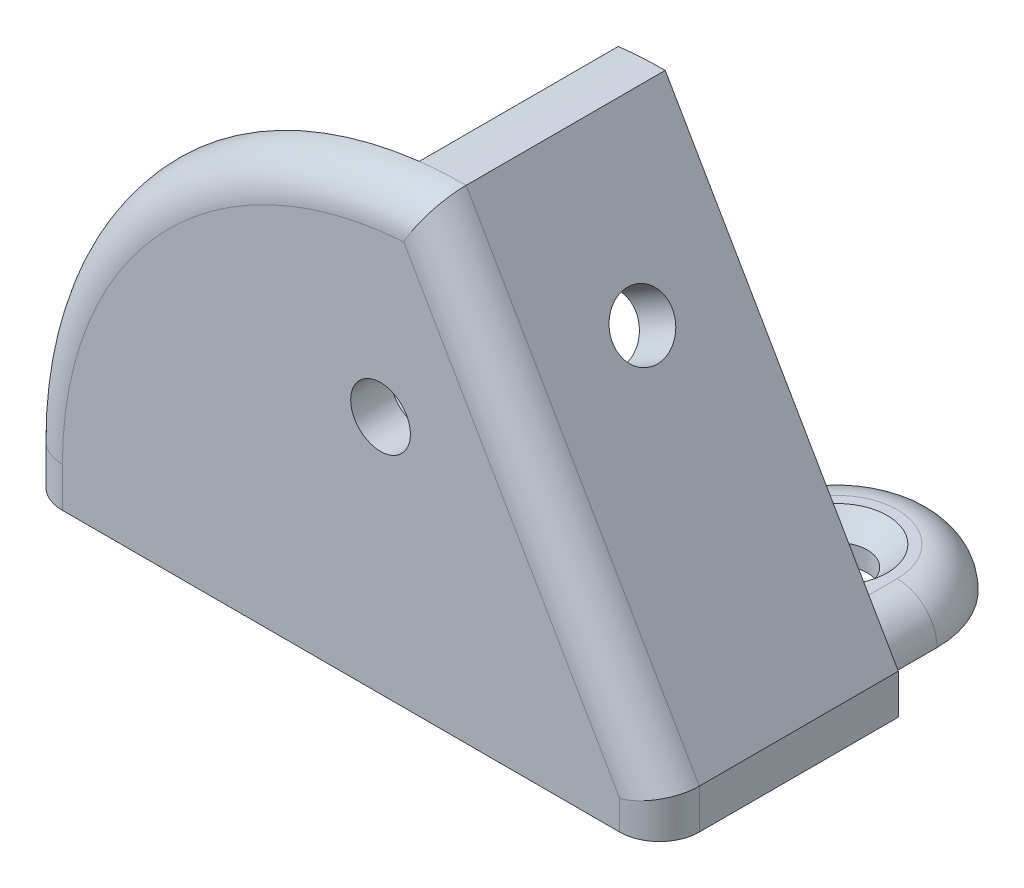
ISO-10303-21;
HEADER;
FILE_DESCRIPTION(('STEP AP214'),'2;1');
FILE_NAME('part.step','',(''),(''),'','','');
FILE_SCHEMA(('AUTOMOTIVE_DESIGN { 1 0 10303 214 1 1 1 1 }'));
ENDSEC;
DATA;
#1=APPLICATION_CONTEXT('core data for automotive mechanical design processes');
#2=APPLICATION_PROTOCOL_DEFINITION('international standard','automotive_design',2000,#1);
#3=PRODUCT_CONTEXT('',#1,'mechanical');
#4=PRODUCT('Part','Part','',(#3));
#5=PRODUCT_RELATED_PRODUCT_CATEGORY('part','',(#4));
#6=PRODUCT_DEFINITION_FORMATION('','',#4);
#7=PRODUCT_DEFINITION_CONTEXT('part definition',#1,'design');
#8=PRODUCT_DEFINITION('design','',#6,#7);
#9=PRODUCT_DEFINITION_SHAPE('','',#8);
#10=(LENGTH_UNIT() NAMED_UNIT(*) SI_UNIT(.MILLI.,.METRE.));
#11=(NAMED_UNIT(*) PLANE_ANGLE_UNIT() SI_UNIT($,.RADIAN.));
#12=(NAMED_UNIT(*) SI_UNIT($,.STERADIAN.) SOLID_ANGLE_UNIT());
#13=UNCERTAINTY_MEASURE_WITH_UNIT(LENGTH_MEASURE(1.E-05),#10,'distance_accuracy_value','');
#14=(GEOMETRIC_REPRESENTATION_CONTEXT(3) GLOBAL_UNCERTAINTY_ASSIGNED_CONTEXT((#13)) GLOBAL_UNIT_ASSIGNED_CONTEXT((#10,
#11,#12)) REPRESENTATION_CONTEXT('',''));
#15=CARTESIAN_POINT('',(0.,0.,0.));
#16=DIRECTION('',(0.,0.,1.));
#17=DIRECTION('',(1.,0.,0.));
#18=AXIS2_PLACEMENT_3D('',#15,#16,#17);
#19=CARTESIAN_POINT('',(0.,0.,-4.));
#20=DIRECTION('',(0.,-1.,0.));
#21=DIRECTION('',(0.,0.,-1.));
#22=AXIS2_PLACEMENT_3D('',#19,#20,#21);
#23=PLANE('',#22);
#24=CARTESIAN_POINT('',(-14.1110533640811,0.,-32.));
#25=DIRECTION('',(0.,1.,0.));
#26=DIRECTION('',(0.,0.,1.));
#27=AXIS2_PLACEMENT_3D('',#24,#25,#26);
#28=CIRCLE('',#27,3.);
#29=CARTESIAN_POINT('',(-14.1110533640811,0.,-29.));
#30=VERTEX_POINT('',#29);
#31=EDGE_CURVE('E396',#30,#30,#28,.T.);
#32=ORIENTED_EDGE('',*,*,#31,.T.);
#33=EDGE_LOOP('',(#32));
#34=FACE_BOUND('',#33,.T.);
#35=CARTESIAN_POINT('',(-52.,0.,-14.));
#36=DIRECTION('',(0.,1.,0.));
#37=DIRECTION('',(-1.,0.,0.));
#38=AXIS2_PLACEMENT_3D('',#35,#36,#37);
#39=CIRCLE('',#38,3.);
#40=CARTESIAN_POINT('',(-55.,0.,-14.));
#41=VERTEX_POINT('',#40);
#42=EDGE_CURVE('E402',#41,#41,#39,.T.);
#43=ORIENTED_EDGE('',*,*,#42,.T.);
#44=EDGE_LOOP('',(#43));
#45=FACE_BOUND('',#44,.T.);
#46=CARTESIAN_POINT('',(-14.1110533640811,0.,-14.));
#47=DIRECTION('',(0.,-1.,0.));
#48=DIRECTION('',(-1.,0.,0.));
#49=AXIS2_PLACEMENT_3D('',#46,#47,#48);
#50=ELLIPSE('',#49,5.77350269189625,5.);
#51=CARTESIAN_POINT('',(-19.8845560559774,0.,-14.));
#52=VERTEX_POINT('',#51);
#53=EDGE_CURVE('E419',#52,#52,#50,.T.);
#54=ORIENTED_EDGE('',*,*,#53,.F.);
#55=EDGE_LOOP('',(#54));
#56=FACE_BOUND('',#55,.T.);
#57=DIRECTION('',(1.,0.,0.));
#58=VECTOR('',#57,1.);
#59=CARTESIAN_POINT('',(0.,0.,0.));
#60=LINE('',#59,#58);
#61=CARTESIAN_POINT('',(-60.,0.,0.));
#62=VERTEX_POINT('',#61);
#63=CARTESIAN_POINT('',(-4.,0.,0.));
#64=VERTEX_POINT('',#63);
#65=EDGE_CURVE('E352',#62,#64,#60,.T.);
#66=ORIENTED_EDGE('',*,*,#65,.F.);
#67=CARTESIAN_POINT('',(-60.,0.,-4.));
#68=DIRECTION('',(0.,-1.,0.));
#69=DIRECTION('',(0.,0.,-1.));
#70=AXIS2_PLACEMENT_3D('',#67,#68,#69);
#71=CIRCLE('',#70,4.);
#72=CARTESIAN_POINT('',(-64.,0.,-4.));
#73=VERTEX_POINT('',#72);
#74=EDGE_CURVE('E197',#62,#73,#71,.T.);
#75=ORIENTED_EDGE('',*,*,#74,.T.);
#76=DIRECTION('',(0.,0.,1.));
#77=VECTOR('',#76,1.);
#78=CARTESIAN_POINT('',(-64.,0.,-4.));
#79=LINE('',#78,#77);
#80=CARTESIAN_POINT('',(-64.,0.,-24.));
#81=VERTEX_POINT('',#80);
#82=EDGE_CURVE('E338',#81,#73,#79,.T.);
#83=ORIENTED_EDGE('',*,*,#82,.F.);
#84=DIRECTION('',(-1.,0.,0.));
#85=VECTOR('',#84,1.);
#86=CARTESIAN_POINT('',(0.,0.,-24.));
#87=LINE('',#86,#85);
#88=CARTESIAN_POINT('',(-24.1110533640811,0.,-24.));
#89=VERTEX_POINT('',#88);
#90=EDGE_CURVE('E166',#89,#81,#87,.T.);
#91=ORIENTED_EDGE('',*,*,#90,.F.);
#92=DIRECTION('',(0.,0.,1.));
#93=VECTOR('',#92,1.);
#94=CARTESIAN_POINT('',(-24.1110533640811,0.,-24.));
#95=LINE('',#94,#93);
#96=CARTESIAN_POINT('',(-24.1110533640811,0.,-32.));
#97=VERTEX_POINT('',#96);
#98=EDGE_CURVE('E154',#97,#89,#95,.T.);
#99=ORIENTED_EDGE('',*,*,#98,.F.);
#100=CARTESIAN_POINT('',(-14.1110533640811,0.,-32.));
#101=DIRECTION('',(0.,1.,0.));
#102=DIRECTION('',(0.,0.,-1.));
#103=AXIS2_PLACEMENT_3D('',#100,#101,#102);
#104=CIRCLE('',#103,10.);
#105=CARTESIAN_POINT('',(-4.11105336408113,0.,-32.));
#106=VERTEX_POINT('',#105);
#107=EDGE_CURVE('E149',#106,#97,#104,.T.);
#108=ORIENTED_EDGE('',*,*,#107,.F.);
#109=DIRECTION('',(0.,0.,-1.));
#110=VECTOR('',#109,1.);
#111=CARTESIAN_POINT('',(-4.11105336408113,0.,-24.));
#112=LINE('',#111,#110);
#113=CARTESIAN_POINT('',(-4.11105336408113,0.,-24.));
#114=VERTEX_POINT('',#113);
#115=EDGE_CURVE('E143',#114,#106,#112,.T.);
#116=ORIENTED_EDGE('',*,*,#115,.F.);
#117=CARTESIAN_POINT('',(0.,0.,-24.));
#118=VERTEX_POINT('',#117);
#119=EDGE_CURVE('E147',#118,#114,#87,.T.);
#120=ORIENTED_EDGE('',*,*,#119,.F.);
#121=DIRECTION('',(0.,0.,1.));
#122=VECTOR('',#121,1.);
#123=CARTESIAN_POINT('',(0.,0.,-4.));
#124=LINE('',#123,#122);
#125=CARTESIAN_POINT('',(0.,0.,-4.));
#126=VERTEX_POINT('',#125);
#127=EDGE_CURVE('E356',#118,#126,#124,.T.);
#128=ORIENTED_EDGE('',*,*,#127,.T.);
#129=CARTESIAN_POINT('',(-4.,0.,-4.));
#130=DIRECTION('',(0.,-1.,0.));
#131=DIRECTION('',(0.,0.,-1.));
#132=AXIS2_PLACEMENT_3D('',#129,#130,#131);
#133=CIRCLE('',#132,4.);
#134=EDGE_CURVE('E195',#126,#64,#133,.T.);
#135=ORIENTED_EDGE('',*,*,#134,.T.);
#136=EDGE_LOOP('',(#66,#75,#83,#91,#99,#108,#116,#120,#128,#135));
#137=FACE_BOUND('',#136,.T.);
#138=ADVANCED_FACE('F33',(#34,#45,#56,#137),#23,.T.);
#139=CARTESIAN_POINT('',(-64.,0.,-4.));
#140=DIRECTION('',(-1.,0.,0.));
#141=DIRECTION('',(0.,0.,1.));
#142=AXIS2_PLACEMENT_3D('',#139,#140,#141);
#143=PLANE('',#142);
#144=ORIENTED_EDGE('',*,*,#82,.T.);
#145=DIRECTION('',(0.,-1.,0.));
#146=VECTOR('',#145,1.);
#147=CARTESIAN_POINT('',(-64.,4.,-4.));
#148=LINE('',#147,#146);
#149=CARTESIAN_POINT('',(-64.,4.,-4.));
#150=VERTEX_POINT('',#149);
#151=EDGE_CURVE('E199',#73,#150,#148,.F.);
#152=ORIENTED_EDGE('',*,*,#151,.T.);
#153=DIRECTION('',(0.,0.,1.));
#154=VECTOR('',#153,1.);
#155=CARTESIAN_POINT('',(-64.,4.,-24.));
#156=LINE('',#155,#154);
#157=CARTESIAN_POINT('',(-64.,4.,-24.));
#158=VERTEX_POINT('',#157);
#159=EDGE_CURVE('E369',#158,#150,#156,.T.);
#160=ORIENTED_EDGE('',*,*,#159,.F.);
#161=DIRECTION('',(0.,1.,0.));
#162=VECTOR('',#161,1.);
#163=CARTESIAN_POINT('',(-64.,0.,-24.));
#164=LINE('',#163,#162);
#165=EDGE_CURVE('E420',#81,#158,#164,.T.);
#166=ORIENTED_EDGE('',*,*,#165,.F.);
#167=EDGE_LOOP('',(#144,#152,#160,#166));
#168=FACE_BOUND('',#167,.T.);
#169=ADVANCED_FACE('F229',(#168),#143,.T.);
#170=CARTESIAN_POINT('',(-23.425625842204,4.,-4.));
#171=DIRECTION('',(0.,0.,1.));
#172=DIRECTION('',(1.,0.,0.));
#173=AXIS2_PLACEMENT_3D('',#170,#171,#172);
#174=CYLINDRICAL_SURFACE('',#173,40.574374157796);
#175=DIRECTION('',(0.,0.,1.));
#176=VECTOR('',#175,1.);
#177=CARTESIAN_POINT('',(-28.1403847306629,44.2995147231393,-24.));
#178=LINE('',#177,#176);
#179=CARTESIAN_POINT('',(-28.1403847306629,44.2995147231393,-24.));
#180=VERTEX_POINT('',#179);
#181=CARTESIAN_POINT('',(-28.1403847306629,44.2995147231393,-4.));
#182=VERTEX_POINT('',#181);
#183=EDGE_CURVE('E165',#180,#182,#178,.T.);
#184=ORIENTED_EDGE('',*,*,#183,.T.);
#185=CARTESIAN_POINT('',(-23.425625842204,4.,-4.));
#186=DIRECTION('',(0.,0.,-1.));
#187=DIRECTION('',(-1.,0.,0.));
#188=AXIS2_PLACEMENT_3D('',#185,#186,#187);
#189=CIRCLE('',#188,40.574374157796);
#190=CARTESIAN_POINT('',(-23.425625842204,44.574374157796,-4.));
#191=VERTEX_POINT('',#190);
#192=EDGE_CURVE('E11',#182,#191,#189,.T.);
#193=ORIENTED_EDGE('',*,*,#192,.T.);
#194=DIRECTION('',(0.,0.,1.));
#195=VECTOR('',#194,1.);
#196=CARTESIAN_POINT('',(-23.425625842204,44.574374157796,-4.));
#197=LINE('',#196,#195);
#198=CARTESIAN_POINT('',(-23.425625842204,44.574374157796,-24.));
#199=VERTEX_POINT('',#198);
#200=EDGE_CURVE('E334',#199,#191,#197,.T.);
#201=ORIENTED_EDGE('',*,*,#200,.F.);
#202=CARTESIAN_POINT('',(-23.425625842204,4.,-24.));
#203=DIRECTION('',(0.,0.,-1.));
#204=DIRECTION('',(-1.,0.,0.));
#205=AXIS2_PLACEMENT_3D('',#202,#203,#204);
#206=CIRCLE('',#205,40.574374157796);
#207=EDGE_CURVE('E431',#180,#199,#206,.T.);
#208=ORIENTED_EDGE('',*,*,#207,.F.);
#209=EDGE_LOOP('',(#184,#193,#201,#208));
#210=FACE_BOUND('',#209,.T.);
#211=ADVANCED_FACE('F235',(#210),#174,.T.);
#212=CARTESIAN_POINT('',(0.,4.,-4.));
#213=DIRECTION('',(0.86602540378444,0.499999999999998,0.));
#214=DIRECTION('',(-0.499999999999998,0.86602540378444,0.));
#215=AXIS2_PLACEMENT_3D('',#212,#213,#214);
#216=PLANE('',#215);
#217=CARTESIAN_POINT('',(-15.715774192431,31.2205193815705,-14.));
#218=DIRECTION('',(0.86602540378444,0.499999999999998,0.));
#219=DIRECTION('',(-0.499999999999998,0.86602540378444,0.));
#220=AXIS2_PLACEMENT_3D('',#217,#218,#219);
#221=CIRCLE('',#220,3.);
#222=CARTESIAN_POINT('',(-14.2157741924311,28.6224431702172,-14.));
#223=VERTEX_POINT('',#222);
#224=EDGE_CURVE('E332',#223,#223,#221,.T.);
#225=ORIENTED_EDGE('',*,*,#224,.F.);
#226=EDGE_LOOP('',(#225));
#227=FACE_BOUND('',#226,.T.);
#228=ORIENTED_EDGE('',*,*,#200,.T.);
#229=DIRECTION('',(-0.499999999999998,0.86602540378444,0.));
#230=VECTOR('',#229,1.);
#231=CARTESIAN_POINT('',(0.,4.,-4.));
#232=LINE('',#231,#230);
#233=CARTESIAN_POINT('',(0.,4.,-4.));
#234=VERTEX_POINT('',#233);
#235=EDGE_CURVE('E42',#191,#234,#232,.F.);
#236=ORIENTED_EDGE('',*,*,#235,.T.);
#237=DIRECTION('',(0.,0.,1.));
#238=VECTOR('',#237,1.);
#239=CARTESIAN_POINT('',(0.,4.,-4.));
#240=LINE('',#239,#238);
#241=CARTESIAN_POINT('',(0.,4.,-24.));
#242=VERTEX_POINT('',#241);
#243=EDGE_CURVE('E339',#242,#234,#240,.T.);
#244=ORIENTED_EDGE('',*,*,#243,.F.);
#245=DIRECTION('',(0.499999999999998,-0.86602540378444,0.));
#246=VECTOR('',#245,1.);
#247=CARTESIAN_POINT('',(-23.425625842204,44.574374157796,-24.));
#248=LINE('',#247,#246);
#249=EDGE_CURVE('E335',#199,#242,#248,.T.);
#250=ORIENTED_EDGE('',*,*,#249,.F.);
#251=EDGE_LOOP('',(#228,#236,#244,#250));
#252=FACE_BOUND('',#251,.T.);
#253=ADVANCED_FACE('F323',(#227,#252),#216,.T.);
#254=CARTESIAN_POINT('',(0.,0.,-4.));
#255=DIRECTION('',(1.,0.,0.));
#256=DIRECTION('',(0.,0.,-1.));
#257=AXIS2_PLACEMENT_3D('',#254,#255,#256);
#258=PLANE('',#257);
#259=ORIENTED_EDGE('',*,*,#243,.T.);
#260=DIRECTION('',(0.,1.,0.));
#261=VECTOR('',#260,1.);
#262=CARTESIAN_POINT('',(0.,0.,-4.));
#263=LINE('',#262,#261);
#264=EDGE_CURVE('E201',#234,#126,#263,.F.);
#265=ORIENTED_EDGE('',*,*,#264,.T.);
#266=ORIENTED_EDGE('',*,*,#127,.F.);
#267=DIRECTION('',(0.,-1.,0.));
#268=VECTOR('',#267,1.);
#269=CARTESIAN_POINT('',(0.,4.,-24.));
#270=LINE('',#269,#268);
#271=EDGE_CURVE('E164',#242,#118,#270,.T.);
#272=ORIENTED_EDGE('',*,*,#271,.F.);
#273=EDGE_LOOP('',(#259,#265,#266,#272));
#274=FACE_BOUND('',#273,.T.);
#275=ADVANCED_FACE('F242',(#274),#258,.T.);
#276=CARTESIAN_POINT('',(-23.425625842204,4.,-4.));
#277=DIRECTION('',(0.,0.,-1.));
#278=DIRECTION('',(-1.,0.,0.));
#279=AXIS2_PLACEMENT_3D('',#276,#277,#278);
#280=PLANE('',#279);
#281=CARTESIAN_POINT('',(-28.0311150230608,24.1102540378444,-4.));
#282=DIRECTION('',(0.,0.,-1.));
#283=DIRECTION('',(-1.,0.,0.));
#284=AXIS2_PLACEMENT_3D('',#281,#282,#283);
#285=CIRCLE('',#284,3.);
#286=CARTESIAN_POINT('',(-31.0311150230608,24.1102540378444,-4.));
#287=VERTEX_POINT('',#286);
#288=EDGE_CURVE('E389',#287,#287,#285,.T.);
#289=ORIENTED_EDGE('',*,*,#288,.F.);
#290=EDGE_LOOP('',(#289));
#291=FACE_BOUND('',#290,.T.);
#292=DIRECTION('',(-0.5,0.866025403784439,0.));
#293=VECTOR('',#292,1.);
#294=CARTESIAN_POINT('',(-14.3708609852165,20.45,-4.));
#295=LINE('',#294,#293);
#296=CARTESIAN_POINT('',(-14.3708609852165,20.45,-4.));
#297=VERTEX_POINT('',#296);
#298=EDGE_CURVE('E363',#297,#182,#295,.T.);
#299=ORIENTED_EDGE('',*,*,#298,.F.);
#300=DIRECTION('',(0.866025403784439,0.5,0.));
#301=VECTOR('',#300,1.);
#302=CARTESIAN_POINT('',(-14.3708609852165,20.45,-4.));
#303=LINE('',#302,#301);
#304=CARTESIAN_POINT('',(-31.6913690609052,10.45,-4.));
#305=VERTEX_POINT('',#304);
#306=EDGE_CURVE('E477',#305,#297,#303,.T.);
#307=ORIENTED_EDGE('',*,*,#306,.F.);
#308=CARTESIAN_POINT('',(-35.4152782971783,8.3,-4.));
#309=DIRECTION('',(0.,0.,1.));
#310=DIRECTION('',(-1.,0.,0.));
#311=AXIS2_PLACEMENT_3D('',#308,#309,#310);
#312=CIRCLE('',#311,4.3);
#313=CARTESIAN_POINT('',(-35.4152782971783,4.,-4.));
#314=VERTEX_POINT('',#313);
#315=EDGE_CURVE('E474',#314,#305,#312,.T.);
#316=ORIENTED_EDGE('',*,*,#315,.F.);
#317=DIRECTION('',(1.,0.,0.));
#318=VECTOR('',#317,1.);
#319=CARTESIAN_POINT('',(-64.,4.,-4.));
#320=LINE('',#319,#318);
#321=EDGE_CURVE('E418',#150,#314,#320,.T.);
#322=ORIENTED_EDGE('',*,*,#321,.F.);
#323=CARTESIAN_POINT('',(-23.425625842204,4.,-4.));
#324=DIRECTION('',(0.,0.,1.));
#325=DIRECTION('',(-1.,0.,0.));
#326=AXIS2_PLACEMENT_3D('',#323,#324,#325);
#327=CIRCLE('',#326,40.574374157796);
#328=EDGE_CURVE('E357',#182,#150,#327,.T.);
#329=ORIENTED_EDGE('',*,*,#328,.F.);
#330=EDGE_LOOP('',(#299,#307,#316,#322,#329));
#331=FACE_BOUND('',#330,.T.);
#332=ADVANCED_FACE('F315',(#291,#331),#280,.T.);
#333=CARTESIAN_POINT('',(-23.425625842204,4.,0.));
#334=DIRECTION('',(0.,0.,-1.));
#335=DIRECTION('',(-1.,0.,0.));
#336=AXIS2_PLACEMENT_3D('',#333,#334,#335);
#337=PLANE('',#336);
#338=CARTESIAN_POINT('',(-28.0311150230608,24.1102540378444,0.));
#339=DIRECTION('',(0.,0.,-1.));
#340=DIRECTION('',(-1.,0.,0.));
#341=AXIS2_PLACEMENT_3D('',#338,#339,#340);
#342=CIRCLE('',#341,3.);
#343=CARTESIAN_POINT('',(-31.0311150230608,24.1102540378444,0.));
#344=VERTEX_POINT('',#343);
#345=EDGE_CURVE('E392',#344,#344,#342,.T.);
#346=ORIENTED_EDGE('',*,*,#345,.T.);
#347=EDGE_LOOP('',(#346));
#348=FACE_BOUND('',#347,.T.);
#349=CARTESIAN_POINT('',(-23.425625842204,4.,0.));
#350=DIRECTION('',(0.,0.,-1.));
#351=DIRECTION('',(-1.,0.,0.));
#352=AXIS2_PLACEMENT_3D('',#349,#350,#351);
#353=CIRCLE('',#352,36.574374157796);
#354=CARTESIAN_POINT('',(-25.6943620973556,40.5039406206921,0.));
#355=VERTEX_POINT('',#354);
#356=CARTESIAN_POINT('',(-60.,4.,0.));
#357=VERTEX_POINT('',#356);
#358=EDGE_CURVE('E171',#355,#357,#353,.F.);
#359=ORIENTED_EDGE('',*,*,#358,.T.);
#360=DIRECTION('',(0.,-1.,0.));
#361=VECTOR('',#360,1.);
#362=CARTESIAN_POINT('',(-60.,0.,0.));
#363=LINE('',#362,#361);
#364=EDGE_CURVE('E192',#357,#62,#363,.T.);
#365=ORIENTED_EDGE('',*,*,#364,.T.);
#366=ORIENTED_EDGE('',*,*,#65,.T.);
#367=DIRECTION('',(0.,1.,0.));
#368=VECTOR('',#367,1.);
#369=CARTESIAN_POINT('',(-4.,4.,0.));
#370=LINE('',#369,#368);
#371=CARTESIAN_POINT('',(-4.,2.92820323027552,0.));
#372=VERTEX_POINT('',#371);
#373=EDGE_CURVE('E190',#64,#372,#370,.T.);
#374=ORIENTED_EDGE('',*,*,#373,.T.);
#375=DIRECTION('',(-0.499999999999998,0.86602540378444,0.));
#376=VECTOR('',#375,1.);
#377=CARTESIAN_POINT('',(-26.8897274573417,42.574374157796,0.));
#378=LINE('',#377,#376);
#379=EDGE_CURVE('E174',#372,#355,#378,.T.);
#380=ORIENTED_EDGE('',*,*,#379,.T.);
#381=EDGE_LOOP('',(#359,#365,#366,#374,#380));
#382=FACE_BOUND('',#381,.T.);
#383=ADVANCED_FACE('F313',(#348,#382),#337,.F.);
#384=CARTESIAN_POINT('',(-64.,4.,-24.));
#385=DIRECTION('',(0.,-1.,0.));
#386=DIRECTION('',(1.,0.,0.));
#387=AXIS2_PLACEMENT_3D('',#384,#385,#386);
#388=PLANE('',#387);
#389=CARTESIAN_POINT('',(-52.,4.,-14.));
#390=DIRECTION('',(0.,1.,0.));
#391=DIRECTION('',(-1.,0.,0.));
#392=AXIS2_PLACEMENT_3D('',#389,#390,#391);
#393=CIRCLE('',#392,3.);
#394=CARTESIAN_POINT('',(-55.,4.,-14.));
#395=VERTEX_POINT('',#394);
#396=EDGE_CURVE('E400',#395,#395,#393,.T.);
#397=ORIENTED_EDGE('',*,*,#396,.F.);
#398=EDGE_LOOP('',(#397));
#399=FACE_BOUND('',#398,.T.);
#400=ORIENTED_EDGE('',*,*,#321,.T.);
#401=DIRECTION('',(0.,0.,1.));
#402=VECTOR('',#401,1.);
#403=CARTESIAN_POINT('',(-35.4152782971783,4.,-24.));
#404=LINE('',#403,#402);
#405=CARTESIAN_POINT('',(-35.4152782971783,4.,-24.));
#406=VERTEX_POINT('',#405);
#407=EDGE_CURVE('E457',#406,#314,#404,.T.);
#408=ORIENTED_EDGE('',*,*,#407,.F.);
#409=DIRECTION('',(1.,0.,0.));
#410=VECTOR('',#409,1.);
#411=CARTESIAN_POINT('',(-64.,4.,-24.));
#412=LINE('',#411,#410);
#413=EDGE_CURVE('E423',#158,#406,#412,.T.);
#414=ORIENTED_EDGE('',*,*,#413,.F.);
#415=ORIENTED_EDGE('',*,*,#159,.T.);
#416=EDGE_LOOP('',(#400,#408,#414,#415));
#417=FACE_BOUND('',#416,.T.);
#418=ADVANCED_FACE('F309',(#399,#417),#388,.F.);
#419=CARTESIAN_POINT('',(-35.4152782971783,8.3,-24.));
#420=DIRECTION('',(0.,0.,1.));
#421=DIRECTION('',(1.,0.,0.));
#422=AXIS2_PLACEMENT_3D('',#419,#420,#421);
#423=CYLINDRICAL_SURFACE('',#422,4.3);
#424=ORIENTED_EDGE('',*,*,#315,.T.);
#425=DIRECTION('',(0.,0.,1.));
#426=VECTOR('',#425,1.);
#427=CARTESIAN_POINT('',(-31.6913690609052,10.45,-24.));
#428=LINE('',#427,#426);
#429=CARTESIAN_POINT('',(-31.6913690609052,10.45,-24.));
#430=VERTEX_POINT('',#429);
#431=EDGE_CURVE('E450',#430,#305,#428,.T.);
#432=ORIENTED_EDGE('',*,*,#431,.F.);
#433=CARTESIAN_POINT('',(-35.4152782971783,8.3,-24.));
#434=DIRECTION('',(0.,0.,1.));
#435=DIRECTION('',(-1.,0.,0.));
#436=AXIS2_PLACEMENT_3D('',#433,#434,#435);
#437=CIRCLE('',#436,4.3);
#438=EDGE_CURVE('E425',#406,#430,#437,.T.);
#439=ORIENTED_EDGE('',*,*,#438,.F.);
#440=ORIENTED_EDGE('',*,*,#407,.T.);
#441=EDGE_LOOP('',(#424,#432,#439,#440));
#442=FACE_BOUND('',#441,.T.);
#443=ADVANCED_FACE('F305',(#442),#423,.F.);
#444=CARTESIAN_POINT('',(-14.3708609852165,20.45,-24.));
#445=DIRECTION('',(0.5,-0.866025403784439,0.));
#446=DIRECTION('',(0.866025403784439,0.5,0.));
#447=AXIS2_PLACEMENT_3D('',#444,#445,#446);
#448=PLANE('',#447);
#449=CARTESIAN_POINT('',(-23.0311150230608,15.45,-14.));
#450=DIRECTION('',(-0.5,0.866025403784439,0.));
#451=DIRECTION('',(-0.866025403784439,-0.5,0.));
#452=AXIS2_PLACEMENT_3D('',#449,#450,#451);
#453=CIRCLE('',#452,3.);
#454=CARTESIAN_POINT('',(-25.6291912344142,13.95,-14.));
#455=VERTEX_POINT('',#454);
#456=EDGE_CURVE('E415',#455,#455,#453,.T.);
#457=ORIENTED_EDGE('',*,*,#456,.F.);
#458=EDGE_LOOP('',(#457));
#459=FACE_BOUND('',#458,.T.);
#460=ORIENTED_EDGE('',*,*,#306,.T.);
#461=DIRECTION('',(0.,0.,1.));
#462=VECTOR('',#461,1.);
#463=CARTESIAN_POINT('',(-14.3708609852165,20.45,-24.));
#464=LINE('',#463,#462);
#465=CARTESIAN_POINT('',(-14.3708609852165,20.45,-24.));
#466=VERTEX_POINT('',#465);
#467=EDGE_CURVE('E447',#466,#297,#464,.T.);
#468=ORIENTED_EDGE('',*,*,#467,.F.);
#469=DIRECTION('',(0.866025403784439,0.5,0.));
#470=VECTOR('',#469,1.);
#471=CARTESIAN_POINT('',(-14.3708609852165,20.45,-24.));
#472=LINE('',#471,#470);
#473=EDGE_CURVE('E427',#430,#466,#472,.T.);
#474=ORIENTED_EDGE('',*,*,#473,.F.);
#475=ORIENTED_EDGE('',*,*,#431,.T.);
#476=EDGE_LOOP('',(#460,#468,#474,#475));
#477=FACE_BOUND('',#476,.T.);
#478=ADVANCED_FACE('F301',(#459,#477),#448,.F.);
#479=CARTESIAN_POINT('',(-14.3708609852165,20.45,-24.));
#480=DIRECTION('',(0.866025403784439,0.5,0.));
#481=DIRECTION('',(-0.5,0.866025403784439,0.));
#482=AXIS2_PLACEMENT_3D('',#479,#480,#481);
#483=PLANE('',#482);
#484=CARTESIAN_POINT('',(-19.3708609852165,29.1102540378444,-14.));
#485=DIRECTION('',(-0.866025403784439,-0.5,0.));
#486=DIRECTION('',(0.5,-0.866025403784439,0.));
#487=AXIS2_PLACEMENT_3D('',#484,#485,#486);
#488=CIRCLE('',#487,3.);
#489=CARTESIAN_POINT('',(-17.8708609852165,26.5121778264911,-14.));
#490=VERTEX_POINT('',#489);
#491=EDGE_CURVE('E405',#490,#490,#488,.T.);
#492=ORIENTED_EDGE('',*,*,#491,.F.);
#493=EDGE_LOOP('',(#492));
#494=FACE_BOUND('',#493,.T.);
#495=ORIENTED_EDGE('',*,*,#298,.T.);
#496=ORIENTED_EDGE('',*,*,#183,.F.);
#497=DIRECTION('',(-0.5,0.866025403784439,0.));
#498=VECTOR('',#497,1.);
#499=CARTESIAN_POINT('',(-14.3708609852165,20.45,-24.));
#500=LINE('',#499,#498);
#501=EDGE_CURVE('E429',#466,#180,#500,.T.);
#502=ORIENTED_EDGE('',*,*,#501,.F.);
#503=ORIENTED_EDGE('',*,*,#467,.T.);
#504=EDGE_LOOP('',(#495,#496,#502,#503));
#505=FACE_BOUND('',#504,.T.);
#506=ADVANCED_FACE('F298',(#494,#505),#483,.F.);
#507=CARTESIAN_POINT('',(-35.4152782971783,8.3,-24.));
#508=DIRECTION('',(0.,0.,-1.));
#509=DIRECTION('',(-1.,0.,0.));
#510=AXIS2_PLACEMENT_3D('',#507,#508,#509);
#511=PLANE('',#510);
#512=ORIENTED_EDGE('',*,*,#119,.T.);
#513=CARTESIAN_POINT('',(-8.11105336408113,0.,-24.));
#514=DIRECTION('',(0.,0.,-1.));
#515=DIRECTION('',(-1.,0.,0.));
#516=AXIS2_PLACEMENT_3D('',#513,#514,#515);
#517=CIRCLE('',#516,4.);
#518=CARTESIAN_POINT('',(-8.11105336408113,4.,-24.));
#519=VERTEX_POINT('',#518);
#520=EDGE_CURVE('E160',#114,#519,#517,.F.);
#521=ORIENTED_EDGE('',*,*,#520,.T.);
#522=DIRECTION('',(1.,0.,0.));
#523=VECTOR('',#522,1.);
#524=CARTESIAN_POINT('',(-24.1110533640811,4.,-24.));
#525=LINE('',#524,#523);
#526=CARTESIAN_POINT('',(-20.1110533640811,4.,-24.));
#527=VERTEX_POINT('',#526);
#528=EDGE_CURVE('E385',#527,#519,#525,.T.);
#529=ORIENTED_EDGE('',*,*,#528,.F.);
#530=CARTESIAN_POINT('',(-20.1110533640811,0.,-24.));
#531=DIRECTION('',(0.,0.,-1.));
#532=DIRECTION('',(-1.,0.,0.));
#533=AXIS2_PLACEMENT_3D('',#530,#531,#532);
#534=CIRCLE('',#533,4.);
#535=EDGE_CURVE('E172',#527,#89,#534,.F.);
#536=ORIENTED_EDGE('',*,*,#535,.T.);
#537=ORIENTED_EDGE('',*,*,#90,.T.);
#538=ORIENTED_EDGE('',*,*,#165,.T.);
#539=ORIENTED_EDGE('',*,*,#413,.T.);
#540=ORIENTED_EDGE('',*,*,#438,.T.);
#541=ORIENTED_EDGE('',*,*,#473,.T.);
#542=ORIENTED_EDGE('',*,*,#501,.T.);
#543=ORIENTED_EDGE('',*,*,#207,.T.);
#544=ORIENTED_EDGE('',*,*,#249,.T.);
#545=ORIENTED_EDGE('',*,*,#271,.T.);
#546=EDGE_LOOP('',(#512,#521,#529,#536,#537,#538,#539,#540,#541,#542,#543,#544,#545));
#547=FACE_BOUND('',#546,.T.);
#548=ADVANCED_FACE('F158',(#547),#511,.T.);
#549=CARTESIAN_POINT('',(-10.5832900230608,-6.11026534372606,-14.));
#550=DIRECTION('',(-0.5,0.866025403784439,0.));
#551=DIRECTION('',(-0.866025403784439,-0.5,0.));
#552=AXIS2_PLACEMENT_3D('',#549,#550,#551);
#553=CYLINDRICAL_SURFACE('',#552,3.);
#554=CARTESIAN_POINT('',(-21.0311150230608,11.9858983848622,-14.));
#555=DIRECTION('',(-0.5,0.866025403784439,0.));
#556=DIRECTION('',(-0.866025403784439,-0.5,0.));
#557=AXIS2_PLACEMENT_3D('',#554,#555,#556);
#558=CIRCLE('',#557,3.);
#559=CARTESIAN_POINT('',(-23.6291912344142,10.4858983848622,-14.));
#560=VERTEX_POINT('',#559);
#561=EDGE_CURVE('E414',#560,#560,#558,.F.);
#562=ORIENTED_EDGE('',*,*,#561,.T.);
#563=EDGE_LOOP('',(#562));
#564=FACE_BOUND('',#563,.T.);
#565=ORIENTED_EDGE('',*,*,#456,.T.);
#566=EDGE_LOOP('',(#565));
#567=FACE_BOUND('',#566,.T.);
#568=ADVANCED_FACE('F288',(#564,#567),#553,.F.);
#569=CARTESIAN_POINT('',(-21.0311150230608,11.9858983848622,-14.));
#570=DIRECTION('',(-0.5,0.866025403784439,0.));
#571=DIRECTION('',(-0.866025403784439,-0.5,0.));
#572=AXIS2_PLACEMENT_3D('',#569,#570,#571);
#573=PLANE('',#572);
#574=CARTESIAN_POINT('',(-21.0311150230608,11.9858983848622,-14.));
#575=DIRECTION('',(-0.5,0.866025403784439,0.));
#576=DIRECTION('',(-0.866025403784439,-0.5,0.));
#577=AXIS2_PLACEMENT_3D('',#574,#575,#576);
#578=CIRCLE('',#577,5.);
#579=CARTESIAN_POINT('',(-25.361242041983,9.48589838486224,-14.));
#580=VERTEX_POINT('',#579);
#581=EDGE_CURVE('E411',#580,#580,#578,.T.);
#582=ORIENTED_EDGE('',*,*,#581,.F.);
#583=EDGE_LOOP('',(#582));
#584=FACE_BOUND('',#583,.T.);
#585=ORIENTED_EDGE('',*,*,#561,.F.);
#586=EDGE_LOOP('',(#585));
#587=FACE_BOUND('',#586,.T.);
#588=ADVANCED_FACE('F285',(#584,#587),#573,.F.);
#589=CARTESIAN_POINT('',(-10.5832900230608,-6.11026534372606,-14.));
#590=DIRECTION('',(-0.5,0.866025403784439,0.));
#591=DIRECTION('',(-0.866025403784439,-0.5,0.));
#592=AXIS2_PLACEMENT_3D('',#589,#590,#591);
#593=CYLINDRICAL_SURFACE('',#592,5.);
#594=ORIENTED_EDGE('',*,*,#53,.T.);
#595=EDGE_LOOP('',(#594));
#596=FACE_BOUND('',#595,.T.);
#597=ORIENTED_EDGE('',*,*,#581,.T.);
#598=EDGE_LOOP('',(#597));
#599=FACE_BOUND('',#598,.T.);
#600=ADVANCED_FACE('F283',(#596,#599),#593,.F.);
#601=CARTESIAN_POINT('',(1.85344518922197,41.3641129210195,-14.));
#602=DIRECTION('',(-0.866025403784438,-0.5,0.));
#603=DIRECTION('',(0.5,-0.866025403784439,0.));
#604=AXIS2_PLACEMENT_3D('',#601,#602,#603);
#605=CYLINDRICAL_SURFACE('',#604,3.);
#606=CARTESIAN_POINT('',(-14.2157741924311,28.6224431702172,-14.));
#607=CARTESIAN_POINT('',(-14.2538480131892,28.6004612395534,-14.));
#608=CARTESIAN_POINT('',(-14.2919218339474,28.5784793088895,-14.));
#609=CARTESIAN_POINT('',(-14.3680694754638,28.5345154475619,-14.));
#610=CARTESIAN_POINT('',(-14.406143296222,28.5125335168981,-14.));
#611=CARTESIAN_POINT('',(-14.4822909377383,28.4685696555705,-14.));
#612=CARTESIAN_POINT('',(-14.5203647584965,28.4465877249067,-14.));
#613=CARTESIAN_POINT('',(-14.5965124000129,28.402623863579,-14.));
#614=CARTESIAN_POINT('',(-14.6345862207711,28.3806419329152,-14.));
#615=CARTESIAN_POINT('',(-14.7107338622874,28.3366780715876,-14.));
#616=CARTESIAN_POINT('',(-14.7488076830456,28.3146961409238,-14.));
#617=CARTESIAN_POINT('',(-14.824955324562,28.2707322795962,-14.));
#618=CARTESIAN_POINT('',(-14.8630291453201,28.2487503489323,-14.));
#619=CARTESIAN_POINT('',(-14.9391767868365,28.2047864876047,-14.));
#620=CARTESIAN_POINT('',(-14.9772506075947,28.1828045569409,-14.));
#621=CARTESIAN_POINT('',(-15.053398249111,28.1388406956133,-14.));
#622=CARTESIAN_POINT('',(-15.0914720698692,28.1168587649495,-14.));
#623=CARTESIAN_POINT('',(-15.1676197113856,28.0728949036218,-14.));
#624=CARTESIAN_POINT('',(-15.2056935321438,28.050912972958,-14.));
#625=CARTESIAN_POINT('',(-15.2818411736601,28.0069491116304,-14.));
#626=CARTESIAN_POINT('',(-15.3199149944183,27.9849671809666,-14.));
#627=CARTESIAN_POINT('',(-15.3960626359347,27.9410033196389,-14.));
#628=CARTESIAN_POINT('',(-15.4341364566929,27.9190213889751,-14.));
#629=CARTESIAN_POINT('',(-15.5102840982092,27.8750575276475,-14.));
#630=CARTESIAN_POINT('',(-15.5483579189674,27.8530755969837,-14.));
#631=CARTESIAN_POINT('',(-15.6245055604838,27.8091117356561,-14.));
#632=CARTESIAN_POINT('',(-15.6625793812419,27.7871298049923,-14.));
#633=CARTESIAN_POINT('',(-15.7387270227583,27.7431659436646,-14.));
#634=CARTESIAN_POINT('',(-15.7768008435165,27.7211840130008,-14.));
#635=CARTESIAN_POINT('',(-15.8529484850328,27.6772201516732,-14.));
#636=CARTESIAN_POINT('',(-15.891022305791,27.6552382210094,-14.));
#637=CARTESIAN_POINT('',(-15.9671699473074,27.6112743596817,-14.));
#638=CARTESIAN_POINT('',(-16.0052437680656,27.5892924290179,-14.));
#639=CARTESIAN_POINT('',(-16.0813914095819,27.5453285676903,-14.));
#640=CARTESIAN_POINT('',(-16.1194652303401,27.5233466370265,-14.));
#641=CARTESIAN_POINT('',(-16.1956128718565,27.4793827756989,-14.));
#642=CARTESIAN_POINT('',(-16.2336866926147,27.4574008450351,-14.));
#643=CARTESIAN_POINT('',(-16.309834334131,27.4134369837074,-14.));
#644=CARTESIAN_POINT('',(-16.3479081548892,27.3914550530436,-14.));
#645=CARTESIAN_POINT('',(-16.4240557964056,27.347491191716,-14.));
#646=CARTESIAN_POINT('',(-16.4621296171638,27.3255092610522,-14.));
#647=CARTESIAN_POINT('',(-16.5382772586801,27.2815453997245,-14.));
#648=CARTESIAN_POINT('',(-16.5763510794383,27.2595634690607,-14.));
#649=CARTESIAN_POINT('',(-16.6524987209547,27.2155996077331,-14.));
#650=CARTESIAN_POINT('',(-16.6905725417128,27.1936176770693,-14.));
#651=CARTESIAN_POINT('',(-16.7667201832292,27.1496538157417,-14.));
#652=CARTESIAN_POINT('',(-16.8047940039874,27.1276718850778,-14.));
#653=CARTESIAN_POINT('',(-16.8809416455037,27.0837080237502,-14.));
#654=CARTESIAN_POINT('',(-16.9190154662619,27.0617260930864,-14.));
#655=CARTESIAN_POINT('',(-16.9951631077783,27.0177622317588,-14.));
#656=CARTESIAN_POINT('',(-17.0332369285365,26.995780301095,-14.));
#657=CARTESIAN_POINT('',(-17.1093845700528,26.9518164397673,-14.));
#658=CARTESIAN_POINT('',(-17.147458390811,26.9298345091035,-14.));
#659=CARTESIAN_POINT('',(-17.2236060323274,26.8858706477759,-14.));
#660=CARTESIAN_POINT('',(-17.2616798530856,26.8638887171121,-14.));
#661=CARTESIAN_POINT('',(-17.3378274946019,26.8199248557845,-14.));
#662=CARTESIAN_POINT('',(-17.3759013153601,26.7979429251206,-14.));
#663=CARTESIAN_POINT('',(-17.4520489568765,26.753979063793,-14.));
#664=CARTESIAN_POINT('',(-17.4901227776346,26.7319971331292,-14.));
#665=CARTESIAN_POINT('',(-17.566270419151,26.6880332718016,-14.));
#666=CARTESIAN_POINT('',(-17.6043442399092,26.6660513411378,-14.));
#667=CARTESIAN_POINT('',(-17.6804918814255,26.6220874798101,-14.));
#668=CARTESIAN_POINT('',(-17.7185657021837,26.6001055491463,-14.));
#669=CARTESIAN_POINT('',(-17.7947133437001,26.5561416878187,-14.));
#670=CARTESIAN_POINT('',(-17.8327871644583,26.5341597571549,-14.));
#671=CARTESIAN_POINT('',(-17.8708609852165,26.5121778264911,-14.));
#672=B_SPLINE_CURVE_WITH_KNOTS('',3,(#606,#607,#608,#609,#610,#611,#612,#613,#614,#615,#616,
#617,#618,#619,#620,#621,#622,#623,#624,#625,#626,#627,#628,#629,#630,#631,#632,#633,#634,#635,
#636,#637,#638,#639,#640,#641,#642,#643,#644,#645,#646,#647,#648,#649,#650,#651,#652,#653,#654,
#655,#656,#657,#658,#659,#660,#661,#662,#663,#664,#665,#666,#667,#668,#669,#670,#671),
.UNSPECIFIED.,.F.,.F.,(4,2,2,2,2,2,2,2,2,2,2,2,2,2,2,2,2,2,2,2,2,2,2,2,2,2,2,2,2,2,2,2,4),(0.,
0.131891583982884,0.263783167965765,0.395674751948645,0.527566335931527,0.659457919914405,
0.791349503897287,0.923241087880167,1.05513267186305,1.18702425584593,1.31891583982881,
1.45080742381169,1.58269900779457,1.71459059177745,1.84648217576033,1.97837375974321,
2.1102653437261,2.24215692770898,2.37404851169186,2.50594009567474,2.63783167965762,
2.7697232636405,2.90161484762338,3.03350643160626,3.16539801558915,3.29728959957203,
3.42918118355491,3.56107276753779,3.69296435152067,3.82485593550355,3.95674751948643,
4.08863910346931,4.22053068745219),.UNSPECIFIED.);
#673=EDGE_CURVE('BSEAM279',#223,#490,#672,.T.);
#674=ORIENTED_EDGE('',*,*,#224,.T.);
#675=ORIENTED_EDGE('',*,*,#491,.T.);
#676=ORIENTED_EDGE('',*,*,#673,.T.);
#677=ORIENTED_EDGE('',*,*,#673,.F.);
#678=EDGE_LOOP('',(#674,#676,#675,#677));
#679=FACE_BOUND('',#678,.T.);
#680=ADVANCED_FACE('F279',(#679),#605,.F.);
#681=CARTESIAN_POINT('',(-52.,0.,-14.));
#682=DIRECTION('',(0.,1.,0.));
#683=DIRECTION('',(-1.,0.,0.));
#684=AXIS2_PLACEMENT_3D('',#681,#682,#683);
#685=CYLINDRICAL_SURFACE('',#684,3.);
#686=ORIENTED_EDGE('',*,*,#42,.F.);
#687=EDGE_LOOP('',(#686));
#688=FACE_BOUND('',#687,.T.);
#689=ORIENTED_EDGE('',*,*,#396,.T.);
#690=EDGE_LOOP('',(#689));
#691=FACE_BOUND('',#690,.T.);
#692=ADVANCED_FACE('F275',(#688,#691),#685,.F.);
#693=CARTESIAN_POINT('',(-28.0311150230608,24.1102540378444,0.));
#694=DIRECTION('',(0.,0.,-1.));
#695=DIRECTION('',(-1.,0.,0.));
#696=AXIS2_PLACEMENT_3D('',#693,#694,#695);
#697=CYLINDRICAL_SURFACE('',#696,3.);
#698=ORIENTED_EDGE('',*,*,#345,.F.);
#699=EDGE_LOOP('',(#698));
#700=FACE_BOUND('',#699,.T.);
#701=ORIENTED_EDGE('',*,*,#288,.T.);
#702=EDGE_LOOP('',(#701));
#703=FACE_BOUND('',#702,.T.);
#704=ADVANCED_FACE('F271',(#700,#703),#697,.F.);
#705=CARTESIAN_POINT('',(-14.1110533640811,4.,-32.));
#706=DIRECTION('',(0.,-1.,0.));
#707=DIRECTION('',(0.,0.,-1.));
#708=AXIS2_PLACEMENT_3D('',#705,#706,#707);
#709=PLANE('',#708);
#710=CARTESIAN_POINT('',(-14.1110533640811,4.,-32.));
#711=DIRECTION('',(0.,1.,0.));
#712=DIRECTION('',(0.,0.,1.));
#713=AXIS2_PLACEMENT_3D('',#710,#711,#712);
#714=CIRCLE('',#713,5.00000000000001);
#715=CARTESIAN_POINT('',(-14.1110533640811,4.,-27.));
#716=VERTEX_POINT('',#715);
#717=EDGE_CURVE('E187',#716,#716,#714,.T.);
#718=ORIENTED_EDGE('',*,*,#717,.F.);
#719=EDGE_LOOP('',(#718));
#720=FACE_BOUND('',#719,.T.);
#721=CARTESIAN_POINT('',(-14.1110533640811,4.,-32.));
#722=DIRECTION('',(0.,-1.,0.));
#723=DIRECTION('',(0.,0.,-1.));
#724=AXIS2_PLACEMENT_3D('',#721,#722,#723);
#725=CIRCLE('',#724,6.);
#726=CARTESIAN_POINT('',(-8.11105336408113,4.,-32.));
#727=VERTEX_POINT('',#726);
#728=CARTESIAN_POINT('',(-20.1110533640811,4.,-32.));
#729=VERTEX_POINT('',#728);
#730=EDGE_CURVE('E376',#727,#729,#725,.F.);
#731=ORIENTED_EDGE('',*,*,#730,.T.);
#732=DIRECTION('',(0.,0.,1.));
#733=VECTOR('',#732,1.);
#734=CARTESIAN_POINT('',(-20.1110533640811,4.,-32.));
#735=LINE('',#734,#733);
#736=EDGE_CURVE('E176',#729,#527,#735,.T.);
#737=ORIENTED_EDGE('',*,*,#736,.T.);
#738=ORIENTED_EDGE('',*,*,#528,.T.);
#739=DIRECTION('',(0.,0.,-1.));
#740=VECTOR('',#739,1.);
#741=CARTESIAN_POINT('',(-8.11105336408113,4.,-32.));
#742=LINE('',#741,#740);
#743=EDGE_CURVE('E170',#519,#727,#742,.T.);
#744=ORIENTED_EDGE('',*,*,#743,.T.);
#745=EDGE_LOOP('',(#731,#737,#738,#744));
#746=FACE_BOUND('',#745,.T.);
#747=ADVANCED_FACE('F263',(#720,#746),#709,.F.);
#748=CARTESIAN_POINT('',(-14.1110533640811,4.,-32.));
#749=DIRECTION('',(0.,1.,0.));
#750=DIRECTION('',(0.,0.,1.));
#751=AXIS2_PLACEMENT_3D('',#748,#749,#750);
#752=CYLINDRICAL_SURFACE('',#751,3.);
#753=ORIENTED_EDGE('',*,*,#31,.F.);
#754=EDGE_LOOP('',(#753));
#755=FACE_BOUND('',#754,.T.);
#756=CARTESIAN_POINT('',(-14.1110533640811,2.,-32.));
#757=DIRECTION('',(0.,1.,0.));
#758=DIRECTION('',(0.,0.,1.));
#759=AXIS2_PLACEMENT_3D('',#756,#757,#758);
#760=CIRCLE('',#759,3.);
#761=CARTESIAN_POINT('',(-14.1110533640811,2.,-29.));
#762=VERTEX_POINT('',#761);
#763=EDGE_CURVE('E478',#762,#762,#760,.T.);
#764=ORIENTED_EDGE('',*,*,#763,.T.);
#765=EDGE_LOOP('',(#764));
#766=FACE_BOUND('',#765,.T.);
#767=ADVANCED_FACE('F257',(#755,#766),#752,.F.);
#768=CARTESIAN_POINT('',(-14.1110533640811,4.,-32.));
#769=DIRECTION('',(0.,1.,0.));
#770=DIRECTION('',(0.,0.,1.));
#771=AXIS2_PLACEMENT_3D('',#768,#769,#770);
#772=CONICAL_SURFACE('',#771,5.00000000000001,0.78539816339745);
#773=ORIENTED_EDGE('',*,*,#763,.F.);
#774=EDGE_LOOP('',(#773));
#775=FACE_BOUND('',#774,.T.);
#776=ORIENTED_EDGE('',*,*,#717,.T.);
#777=EDGE_LOOP('',(#776));
#778=FACE_BOUND('',#777,.T.);
#779=ADVANCED_FACE('F253',(#775,#778),#772,.F.);
#780=CARTESIAN_POINT('',(-8.11105336408113,0.,-32.));
#781=DIRECTION('',(0.,0.,-1.));
#782=DIRECTION('',(-1.,0.,0.));
#783=AXIS2_PLACEMENT_3D('',#780,#781,#782);
#784=CYLINDRICAL_SURFACE('',#783,4.);
#785=ORIENTED_EDGE('',*,*,#520,.F.);
#786=ORIENTED_EDGE('',*,*,#115,.T.);
#787=CARTESIAN_POINT('',(-8.11105336408113,0.,-32.));
#788=DIRECTION('',(0.,0.,-1.));
#789=DIRECTION('',(-1.,0.,0.));
#790=AXIS2_PLACEMENT_3D('',#787,#788,#789);
#791=CIRCLE('',#790,4.);
#792=EDGE_CURVE('E186',#727,#106,#791,.T.);
#793=ORIENTED_EDGE('',*,*,#792,.F.);
#794=ORIENTED_EDGE('',*,*,#743,.F.);
#795=EDGE_LOOP('',(#785,#786,#793,#794));
#796=FACE_BOUND('',#795,.T.);
#797=ADVANCED_FACE('F169',(#796),#784,.T.);
#798=CARTESIAN_POINT('',(-14.1110533640811,0.,-32.));
#799=DIRECTION('',(0.,-1.,0.));
#800=DIRECTION('',(0.,0.,-1.));
#801=AXIS2_PLACEMENT_3D('',#798,#799,#800);
#802=TOROIDAL_SURFACE('',#801,6.,4.);
#803=ORIENTED_EDGE('',*,*,#792,.T.);
#804=ORIENTED_EDGE('',*,*,#107,.T.);
#805=CARTESIAN_POINT('',(-20.1110533640811,0.,-32.));
#806=DIRECTION('',(0.,0.,1.));
#807=DIRECTION('',(1.,0.,0.));
#808=AXIS2_PLACEMENT_3D('',#805,#806,#807);
#809=CIRCLE('',#808,4.);
#810=EDGE_CURVE('E183',#729,#97,#809,.T.);
#811=ORIENTED_EDGE('',*,*,#810,.F.);
#812=ORIENTED_EDGE('',*,*,#730,.F.);
#813=EDGE_LOOP('',(#803,#804,#811,#812));
#814=FACE_BOUND('',#813,.T.);
#815=ADVANCED_FACE('F247',(#814),#802,.T.);
#816=CARTESIAN_POINT('',(-20.1110533640811,0.,-32.));
#817=DIRECTION('',(0.,0.,1.));
#818=DIRECTION('',(1.,0.,0.));
#819=AXIS2_PLACEMENT_3D('',#816,#817,#818);
#820=CYLINDRICAL_SURFACE('',#819,4.);
#821=ORIENTED_EDGE('',*,*,#810,.T.);
#822=ORIENTED_EDGE('',*,*,#98,.T.);
#823=ORIENTED_EDGE('',*,*,#535,.F.);
#824=ORIENTED_EDGE('',*,*,#736,.F.);
#825=EDGE_LOOP('',(#821,#822,#823,#824));
#826=FACE_BOUND('',#825,.T.);
#827=ADVANCED_FACE('F244',(#826),#820,.T.);
#828=CARTESIAN_POINT('',(-4.,4.,-4.));
#829=DIRECTION('',(0.,-1.,0.));
#830=DIRECTION('',(0.,0.,-1.));
#831=AXIS2_PLACEMENT_3D('',#828,#829,#830);
#832=CYLINDRICAL_SURFACE('',#831,4.);
#833=ORIENTED_EDGE('',*,*,#134,.F.);
#834=ORIENTED_EDGE('',*,*,#264,.F.);
#835=CARTESIAN_POINT('',(-4.,2.92820323027552,-4.));
#836=DIRECTION('',(0.258819045102519,-0.965925826289069,0.));
#837=DIRECTION('',(0.965925826289069,0.258819045102519,0.));
#838=AXIS2_PLACEMENT_3D('',#835,#836,#837);
#839=ELLIPSE('',#838,4.14110472164033,4.);
#840=EDGE_CURVE('E37',#372,#234,#839,.F.);
#841=ORIENTED_EDGE('',*,*,#840,.F.);
#842=ORIENTED_EDGE('',*,*,#373,.F.);
#843=EDGE_LOOP('',(#833,#834,#841,#842));
#844=FACE_BOUND('',#843,.T.);
#845=ADVANCED_FACE('F35',(#844),#832,.T.);
#846=CARTESIAN_POINT('',(-9.32050807568869,12.1435935394489,-4.));
#847=DIRECTION('',(0.499999999999998,-0.86602540378444,0.));
#848=DIRECTION('',(0.86602540378444,0.499999999999998,0.));
#849=AXIS2_PLACEMENT_3D('',#846,#847,#848);
#850=CYLINDRICAL_SURFACE('',#849,4.);
#851=ORIENTED_EDGE('',*,*,#840,.T.);
#852=ORIENTED_EDGE('',*,*,#235,.F.);
#853=CARTESIAN_POINT('',(-23.425625842204,44.574374157796,-4.));
#854=CARTESIAN_POINT('',(-23.4256148727615,44.5743916166395,-3.89842894236719));
#855=CARTESIAN_POINT('',(-23.4278589951402,44.5705061802347,-3.79686502681872));
#856=CARTESIAN_POINT('',(-23.4367762380131,44.5550589411285,-3.59454967772442));
#857=CARTESIAN_POINT('',(-23.4434479532855,44.5434995739661,-3.49379799665829));
#858=CARTESIAN_POINT('',(-23.461102983938,44.5128966809172,-3.29425026579992));
#859=CARTESIAN_POINT('',(-23.4720684898997,44.4938840686007,-3.19544788645966));
#860=CARTESIAN_POINT('',(-23.4981616194625,44.4486126821718,-3.00007925700342));
#861=CARTESIAN_POINT('',(-23.5132894099569,44.4223536175016,-2.90351309672051));
#862=CARTESIAN_POINT('',(-23.5474980781782,44.3629245600997,-2.7133668245042));
#863=CARTESIAN_POINT('',(-23.566574691853,44.3297620217191,-2.61978361625364));
#864=CARTESIAN_POINT('',(-23.6084588803523,44.2568787244748,-2.43605607807267));
#865=CARTESIAN_POINT('',(-23.6312678585699,44.2171554986977,-2.34591305745859));
#866=CARTESIAN_POINT('',(-23.704934828377,44.0887122367328,-2.0813771582299));
#867=CARTESIAN_POINT('',(-23.7610414557662,43.9907037097353,-1.91283042068929));
#868=CARTESIAN_POINT('',(-23.8879777603797,43.7682915612088,-1.58695043837267));
#869=CARTESIAN_POINT('',(-23.9593992055805,43.6428207044701,-1.43058662022092));
#870=CARTESIAN_POINT('',(-24.1124565873416,43.3729249927779,-1.14100340909738));
#871=CARTESIAN_POINT('',(-24.194094900212,43.2284957279628,-1.00778941774683));
#872=CARTESIAN_POINT('',(-24.3759528768878,42.9054063338829,-0.750414331358203));
#873=CARTESIAN_POINT('',(-24.4772166355252,42.7247272485018,-0.629531168598263));
#874=CARTESIAN_POINT('',(-24.6865165855865,42.349318910459,-0.419314301514489));
#875=CARTESIAN_POINT('',(-24.7945603527066,42.1545739030932,-0.330016656092396));
#876=CARTESIAN_POINT('',(-25.0323227774042,41.7235869031315,-0.171339046121868));
#877=CARTESIAN_POINT('',(-25.1627347665331,41.4857049668226,-0.107464608072448));
#878=CARTESIAN_POINT('',(-25.4250878945407,41.003795021471,-0.0221817084819699));
#879=CARTESIAN_POINT('',(-25.5570253109883,40.7597807482012,-0.000685650970961672));
#880=CARTESIAN_POINT('',(-25.6901476812349,40.5117928457999,-5.37301824531307E-06));
#881=CARTESIAN_POINT('',(-25.6922550124572,40.5078667326075,7.62035864153538E-09));
#882=CARTESIAN_POINT('',(-25.6943620973556,40.5039406206921,0.));
#883=B_SPLINE_CURVE_WITH_KNOTS('',3,(#853,#854,#855,#856,#857,#858,#859,#860,#861,#862,#863,
#864,#865,#866,#867,#868,#869,#870,#871,#872,#873,#874,#875,#876,#877,#878,#879,#880,#881,#882),
.UNSPECIFIED.,.F.,.F.,(4,2,2,2,2,2,2,2,2,2,2,2,2,2,4),(0.,0.304602962614185,0.60910929705401,
0.912365781198898,1.21563442665846,1.51857728650292,1.82163431767763,2.42759992802899,
3.0635907368497,3.6997297447142,4.41635547171348,5.13379669782644,5.96651138242526,
6.79750303638322,6.81087078608732),.UNSPECIFIED.);
#884=EDGE_CURVE('E208',#355,#191,#883,.F.);
#885=ORIENTED_EDGE('',*,*,#884,.F.);
#886=ORIENTED_EDGE('',*,*,#379,.F.);
#887=EDGE_LOOP('',(#851,#852,#885,#886));
#888=FACE_BOUND('',#887,.T.);
#889=ADVANCED_FACE('F214',(#888),#850,.T.);
#890=CARTESIAN_POINT('',(-23.425625842204,4.,-4.));
#891=DIRECTION('',(0.,0.,-1.));
#892=DIRECTION('',(-1.,0.,0.));
#893=AXIS2_PLACEMENT_3D('',#890,#891,#892);
#894=TOROIDAL_SURFACE('',#893,36.574374157796,4.);
#895=ORIENTED_EDGE('',*,*,#192,.F.);
#896=ORIENTED_EDGE('',*,*,#328,.T.);
#897=CARTESIAN_POINT('',(-60.,4.,-4.));
#898=DIRECTION('',(0.,-1.,0.));
#899=DIRECTION('',(0.,0.,-1.));
#900=AXIS2_PLACEMENT_3D('',#897,#898,#899);
#901=CIRCLE('',#900,4.);
#902=EDGE_CURVE('E206',#357,#150,#901,.T.);
#903=ORIENTED_EDGE('',*,*,#902,.F.);
#904=ORIENTED_EDGE('',*,*,#358,.F.);
#905=ORIENTED_EDGE('',*,*,#884,.T.);
#906=EDGE_LOOP('',(#895,#896,#903,#904,#905));
#907=FACE_BOUND('',#906,.T.);
#908=ADVANCED_FACE('F217',(#907),#894,.T.);
#909=CARTESIAN_POINT('',(-60.,4.,-4.));
#910=DIRECTION('',(0.,1.,0.));
#911=DIRECTION('',(0.,0.,1.));
#912=AXIS2_PLACEMENT_3D('',#909,#910,#911);
#913=CYLINDRICAL_SURFACE('',#912,4.);
#914=ORIENTED_EDGE('',*,*,#902,.T.);
#915=ORIENTED_EDGE('',*,*,#151,.F.);
#916=ORIENTED_EDGE('',*,*,#74,.F.);
#917=ORIENTED_EDGE('',*,*,#364,.F.);
#918=EDGE_LOOP('',(#914,#915,#916,#917));
#919=FACE_BOUND('',#918,.T.);
#920=ADVANCED_FACE('F220',(#919),#913,.T.);
#921=CLOSED_SHELL('',(#138,#169,#211,#253,#275,#332,#383,#418,#443,#478,#506,#548,#568,#588,
#600,#680,#692,#704,#747,#767,#779,#797,#815,#827,#845,#889,#908,#920));
#922=MANIFOLD_SOLID_BREP('B2',#921);
#923=ADVANCED_BREP_SHAPE_REPRESENTATION('',(#18,#922),#14);
#924=SHAPE_DEFINITION_REPRESENTATION(#9,#923);
ENDSEC;
END-ISO-10303-21;
